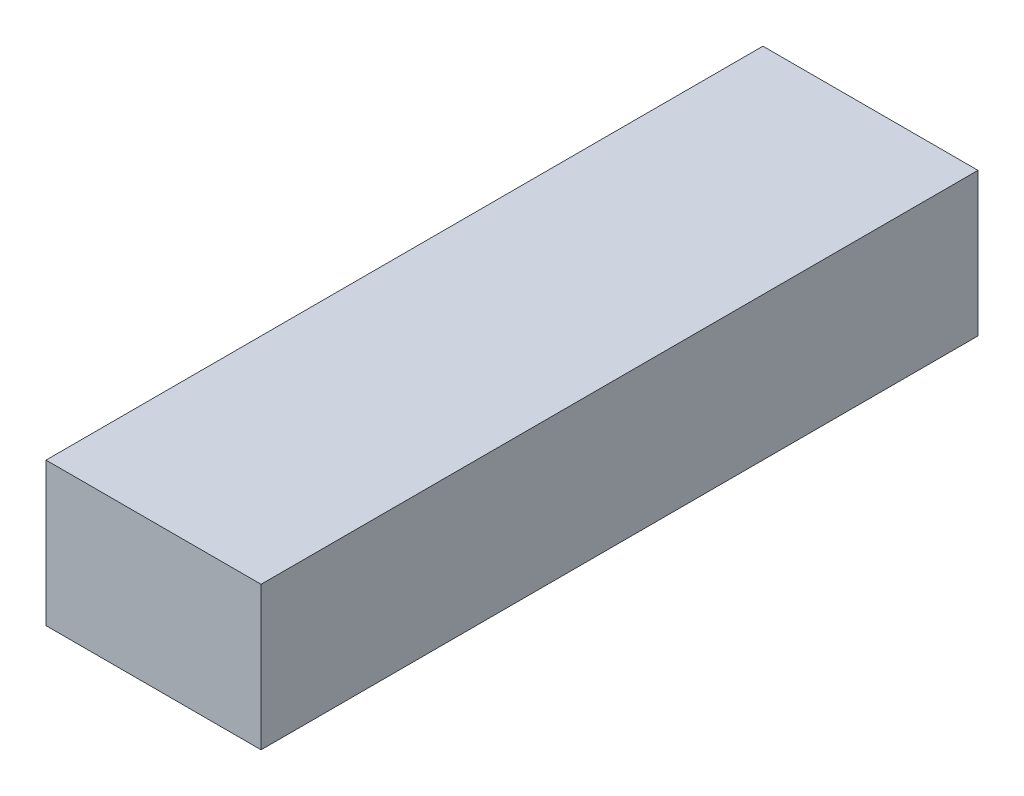
ISO-10303-21;
HEADER;
FILE_DESCRIPTION(('STEP AP214'),'2;1');
FILE_NAME('part.step','',(''),(''),'','','');
FILE_SCHEMA(('AUTOMOTIVE_DESIGN { 1 0 10303 214 1 1 1 1 }'));
ENDSEC;
DATA;
#1=APPLICATION_CONTEXT('core data for automotive mechanical design processes');
#2=APPLICATION_PROTOCOL_DEFINITION('international standard','automotive_design',2000,#1);
#3=PRODUCT_CONTEXT('',#1,'mechanical');
#4=PRODUCT('Part','Part','',(#3));
#5=PRODUCT_RELATED_PRODUCT_CATEGORY('part','',(#4));
#6=PRODUCT_DEFINITION_FORMATION('','',#4);
#7=PRODUCT_DEFINITION_CONTEXT('part definition',#1,'design');
#8=PRODUCT_DEFINITION('design','',#6,#7);
#9=PRODUCT_DEFINITION_SHAPE('','',#8);
#10=(LENGTH_UNIT() NAMED_UNIT(*) SI_UNIT(.MILLI.,.METRE.));
#11=(NAMED_UNIT(*) PLANE_ANGLE_UNIT() SI_UNIT($,.RADIAN.));
#12=(NAMED_UNIT(*) SI_UNIT($,.STERADIAN.) SOLID_ANGLE_UNIT());
#13=UNCERTAINTY_MEASURE_WITH_UNIT(LENGTH_MEASURE(1.E-05),#10,'distance_accuracy_value','');
#14=(GEOMETRIC_REPRESENTATION_CONTEXT(3) GLOBAL_UNCERTAINTY_ASSIGNED_CONTEXT((#13)) GLOBAL_UNIT_ASSIGNED_CONTEXT((#10,
#11,#12)) REPRESENTATION_CONTEXT('',''));
#15=CARTESIAN_POINT('',(0.,0.,0.));
#16=DIRECTION('',(0.,0.,1.));
#17=DIRECTION('',(1.,0.,0.));
#18=AXIS2_PLACEMENT_3D('',#15,#16,#17);
#19=CARTESIAN_POINT('',(3.,-2.,-20.));
#20=DIRECTION('',(1.,0.,0.));
#21=DIRECTION('',(0.,0.,-1.));
#22=AXIS2_PLACEMENT_3D('',#19,#20,#21);
#23=PLANE('',#22);
#24=DIRECTION('',(0.,1.,0.));
#25=VECTOR('',#24,1.);
#26=CARTESIAN_POINT('',(3.,-2.,0.));
#27=LINE('',#26,#25);
#28=CARTESIAN_POINT('',(3.,-2.,0.));
#29=VERTEX_POINT('',#28);
#30=CARTESIAN_POINT('',(3.,2.,0.));
#31=VERTEX_POINT('',#30);
#32=EDGE_CURVE('E101',#29,#31,#27,.T.);
#33=ORIENTED_EDGE('',*,*,#32,.F.);
#34=DIRECTION('',(0.,0.,1.));
#35=VECTOR('',#34,1.);
#36=CARTESIAN_POINT('',(3.,-2.,-20.));
#37=LINE('',#36,#35);
#38=CARTESIAN_POINT('',(3.,-2.,-20.));
#39=VERTEX_POINT('',#38);
#40=EDGE_CURVE('E11',#39,#29,#37,.T.);
#41=ORIENTED_EDGE('',*,*,#40,.F.);
#42=DIRECTION('',(0.,1.,0.));
#43=VECTOR('',#42,1.);
#44=CARTESIAN_POINT('',(3.,-2.,-20.));
#45=LINE('',#44,#43);
#46=CARTESIAN_POINT('',(3.,2.,-20.));
#47=VERTEX_POINT('',#46);
#48=EDGE_CURVE('E95',#39,#47,#45,.T.);
#49=ORIENTED_EDGE('',*,*,#48,.T.);
#50=DIRECTION('',(0.,0.,1.));
#51=VECTOR('',#50,1.);
#52=CARTESIAN_POINT('',(3.,2.,-20.));
#53=LINE('',#52,#51);
#54=EDGE_CURVE('E40',#47,#31,#53,.T.);
#55=ORIENTED_EDGE('',*,*,#54,.T.);
#56=EDGE_LOOP('',(#33,#41,#49,#55));
#57=FACE_BOUND('',#56,.T.);
#58=ADVANCED_FACE('F37',(#57),#23,.T.);
#59=CARTESIAN_POINT('',(-3.,-2.,-20.));
#60=DIRECTION('',(0.,-1.,0.));
#61=DIRECTION('',(0.,0.,-1.));
#62=AXIS2_PLACEMENT_3D('',#59,#60,#61);
#63=PLANE('',#62);
#64=DIRECTION('',(1.,0.,0.));
#65=VECTOR('',#64,1.);
#66=CARTESIAN_POINT('',(-3.,-2.,0.));
#67=LINE('',#66,#65);
#68=CARTESIAN_POINT('',(-3.,-2.,0.));
#69=VERTEX_POINT('',#68);
#70=EDGE_CURVE('E97',#69,#29,#67,.T.);
#71=ORIENTED_EDGE('',*,*,#70,.F.);
#72=DIRECTION('',(0.,0.,1.));
#73=VECTOR('',#72,1.);
#74=CARTESIAN_POINT('',(-3.,-2.,-20.));
#75=LINE('',#74,#73);
#76=CARTESIAN_POINT('',(-3.,-2.,-20.));
#77=VERTEX_POINT('',#76);
#78=EDGE_CURVE('E46',#77,#69,#75,.T.);
#79=ORIENTED_EDGE('',*,*,#78,.F.);
#80=DIRECTION('',(1.,0.,0.));
#81=VECTOR('',#80,1.);
#82=CARTESIAN_POINT('',(-3.,-2.,-20.));
#83=LINE('',#82,#81);
#84=EDGE_CURVE('E92',#77,#39,#83,.T.);
#85=ORIENTED_EDGE('',*,*,#84,.T.);
#86=ORIENTED_EDGE('',*,*,#40,.T.);
#87=EDGE_LOOP('',(#71,#79,#85,#86));
#88=FACE_BOUND('',#87,.T.);
#89=ADVANCED_FACE('F111',(#88),#63,.T.);
#90=CARTESIAN_POINT('',(-3.,-2.,-20.));
#91=DIRECTION('',(-1.,0.,0.));
#92=DIRECTION('',(0.,0.,1.));
#93=AXIS2_PLACEMENT_3D('',#90,#91,#92);
#94=PLANE('',#93);
#95=DIRECTION('',(0.,-1.,0.));
#96=VECTOR('',#95,1.);
#97=CARTESIAN_POINT('',(-3.,-2.,0.));
#98=LINE('',#97,#96);
#99=CARTESIAN_POINT('',(-3.,2.,0.));
#100=VERTEX_POINT('',#99);
#101=EDGE_CURVE('E87',#100,#69,#98,.T.);
#102=ORIENTED_EDGE('',*,*,#101,.F.);
#103=DIRECTION('',(0.,0.,1.));
#104=VECTOR('',#103,1.);
#105=CARTESIAN_POINT('',(-3.,2.,-20.));
#106=LINE('',#105,#104);
#107=CARTESIAN_POINT('',(-3.,2.,-20.));
#108=VERTEX_POINT('',#107);
#109=EDGE_CURVE('E82',#108,#100,#106,.T.);
#110=ORIENTED_EDGE('',*,*,#109,.F.);
#111=DIRECTION('',(0.,-1.,0.));
#112=VECTOR('',#111,1.);
#113=CARTESIAN_POINT('',(-3.,-2.,-20.));
#114=LINE('',#113,#112);
#115=EDGE_CURVE('E85',#108,#77,#114,.T.);
#116=ORIENTED_EDGE('',*,*,#115,.T.);
#117=ORIENTED_EDGE('',*,*,#78,.T.);
#118=EDGE_LOOP('',(#102,#110,#116,#117));
#119=FACE_BOUND('',#118,.T.);
#120=ADVANCED_FACE('F84',(#119),#94,.T.);
#121=CARTESIAN_POINT('',(-3.,2.,-20.));
#122=DIRECTION('',(0.,1.,0.));
#123=DIRECTION('',(0.,0.,1.));
#124=AXIS2_PLACEMENT_3D('',#121,#122,#123);
#125=PLANE('',#124);
#126=DIRECTION('',(-1.,0.,0.));
#127=VECTOR('',#126,1.);
#128=CARTESIAN_POINT('',(-3.,2.,0.));
#129=LINE('',#128,#127);
#130=EDGE_CURVE('E104',#31,#100,#129,.T.);
#131=ORIENTED_EDGE('',*,*,#130,.F.);
#132=ORIENTED_EDGE('',*,*,#54,.F.);
#133=DIRECTION('',(-1.,0.,0.));
#134=VECTOR('',#133,1.);
#135=CARTESIAN_POINT('',(-3.,2.,-20.));
#136=LINE('',#135,#134);
#137=EDGE_CURVE('E91',#47,#108,#136,.T.);
#138=ORIENTED_EDGE('',*,*,#137,.T.);
#139=ORIENTED_EDGE('',*,*,#109,.T.);
#140=EDGE_LOOP('',(#131,#132,#138,#139));
#141=FACE_BOUND('',#140,.T.);
#142=ADVANCED_FACE('F94',(#141),#125,.T.);
#143=CARTESIAN_POINT('',(0.,0.,-20.));
#144=DIRECTION('',(0.,0.,-1.));
#145=DIRECTION('',(-1.,0.,0.));
#146=AXIS2_PLACEMENT_3D('',#143,#144,#145);
#147=PLANE('',#146);
#148=ORIENTED_EDGE('',*,*,#48,.F.);
#149=ORIENTED_EDGE('',*,*,#84,.F.);
#150=ORIENTED_EDGE('',*,*,#115,.F.);
#151=ORIENTED_EDGE('',*,*,#137,.F.);
#152=EDGE_LOOP('',(#148,#149,#150,#151));
#153=FACE_BOUND('',#152,.T.);
#154=ADVANCED_FACE('F90',(#153),#147,.T.);
#155=CARTESIAN_POINT('',(0.,0.,0.));
#156=DIRECTION('',(0.,0.,-1.));
#157=DIRECTION('',(-1.,0.,0.));
#158=AXIS2_PLACEMENT_3D('',#155,#156,#157);
#159=PLANE('',#158);
#160=ORIENTED_EDGE('',*,*,#32,.T.);
#161=ORIENTED_EDGE('',*,*,#130,.T.);
#162=ORIENTED_EDGE('',*,*,#101,.T.);
#163=ORIENTED_EDGE('',*,*,#70,.T.);
#164=EDGE_LOOP('',(#160,#161,#162,#163));
#165=FACE_BOUND('',#164,.T.);
#166=ADVANCED_FACE('F110',(#165),#159,.F.);
#167=CLOSED_SHELL('',(#58,#89,#120,#142,#154,#166));
#168=MANIFOLD_SOLID_BREP('B2',#167);
#169=ADVANCED_BREP_SHAPE_REPRESENTATION('',(#18,#168),#14);
#170=SHAPE_DEFINITION_REPRESENTATION(#9,#169);
ENDSEC;
END-ISO-10303-21;
